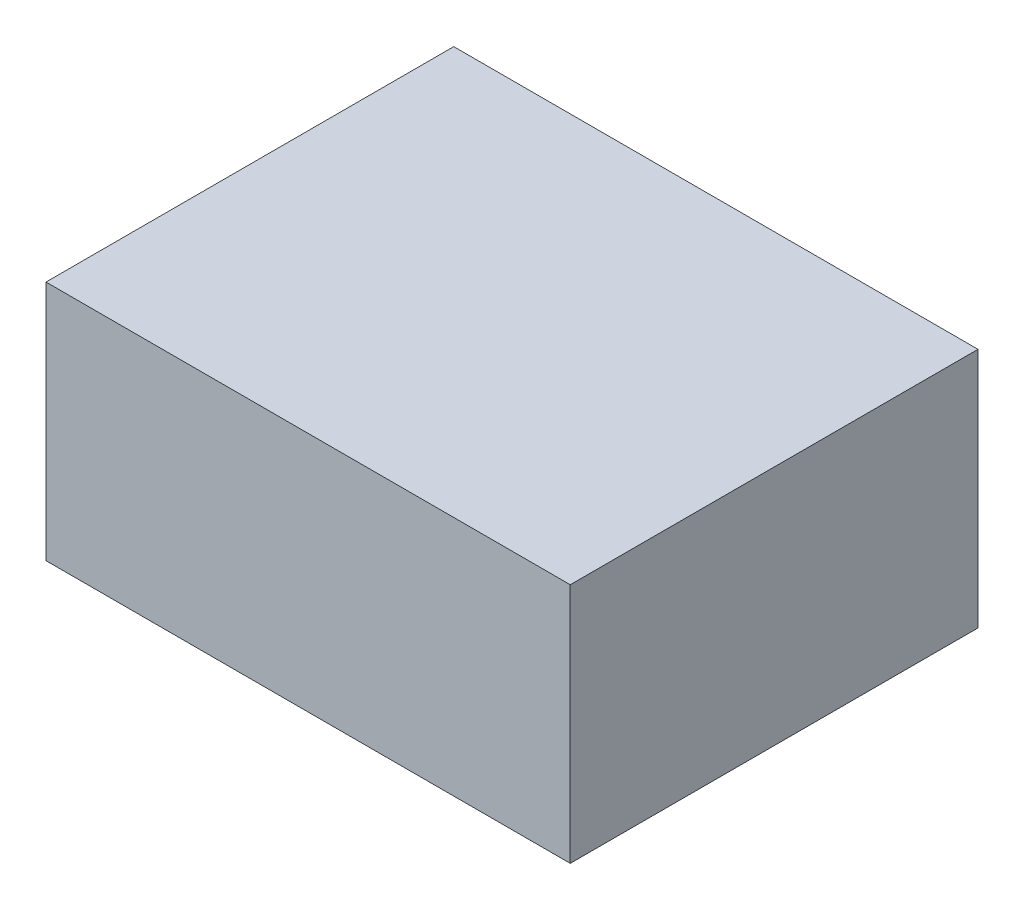
ISO-10303-21;
HEADER;
FILE_DESCRIPTION(('STEP AP214'),'2;1');
FILE_NAME('part.step','',(''),(''),'','','');
FILE_SCHEMA(('AUTOMOTIVE_DESIGN { 1 0 10303 214 1 1 1 1 }'));
ENDSEC;
DATA;
#1=APPLICATION_CONTEXT('core data for automotive mechanical design processes');
#2=APPLICATION_PROTOCOL_DEFINITION('international standard','automotive_design',2000,#1);
#3=PRODUCT_CONTEXT('',#1,'mechanical');
#4=PRODUCT('Part','Part','',(#3));
#5=PRODUCT_RELATED_PRODUCT_CATEGORY('part','',(#4));
#6=PRODUCT_DEFINITION_FORMATION('','',#4);
#7=PRODUCT_DEFINITION_CONTEXT('part definition',#1,'design');
#8=PRODUCT_DEFINITION('design','',#6,#7);
#9=PRODUCT_DEFINITION_SHAPE('','',#8);
#10=(LENGTH_UNIT() NAMED_UNIT(*) SI_UNIT(.MILLI.,.METRE.));
#11=(NAMED_UNIT(*) PLANE_ANGLE_UNIT() SI_UNIT($,.RADIAN.));
#12=(NAMED_UNIT(*) SI_UNIT($,.STERADIAN.) SOLID_ANGLE_UNIT());
#13=UNCERTAINTY_MEASURE_WITH_UNIT(LENGTH_MEASURE(1.E-05),#10,'distance_accuracy_value','');
#14=(GEOMETRIC_REPRESENTATION_CONTEXT(3) GLOBAL_UNCERTAINTY_ASSIGNED_CONTEXT((#13)) GLOBAL_UNIT_ASSIGNED_CONTEXT((#10,
#11,#12)) REPRESENTATION_CONTEXT('',''));
#15=CARTESIAN_POINT('',(0.,0.,0.));
#16=DIRECTION('',(0.,0.,1.));
#17=DIRECTION('',(1.,0.,0.));
#18=AXIS2_PLACEMENT_3D('',#15,#16,#17);
#19=CARTESIAN_POINT('',(3.15000132,1.44999964,0.));
#20=DIRECTION('',(0.,-1.,0.));
#21=DIRECTION('',(0.,0.,-1.));
#22=AXIS2_PLACEMENT_3D('',#19,#20,#21);
#23=PLANE('',#22);
#24=DIRECTION('',(0.,0.,-1.));
#25=VECTOR('',#24,1.);
#26=CARTESIAN_POINT('',(-3.14999878,1.44999964,0.));
#27=LINE('',#26,#25);
#28=CARTESIAN_POINT('',(-3.14999878,1.44999964,0.));
#29=VERTEX_POINT('',#28);
#30=CARTESIAN_POINT('',(-3.14999878,1.44999964,4.90000036));
#31=VERTEX_POINT('',#30);
#32=EDGE_CURVE('E20',#29,#31,#27,.F.);
#33=ORIENTED_EDGE('',*,*,#32,.T.);
#34=DIRECTION('',(-1.,0.,0.));
#35=VECTOR('',#34,1.);
#36=CARTESIAN_POINT('',(-3.14999878,1.44999964,4.90000036));
#37=LINE('',#36,#35);
#38=CARTESIAN_POINT('',(3.15000132,1.44999964,4.90000036));
#39=VERTEX_POINT('',#38);
#40=EDGE_CURVE('E55',#31,#39,#37,.F.);
#41=ORIENTED_EDGE('',*,*,#40,.T.);
#42=DIRECTION('',(0.,0.,1.));
#43=VECTOR('',#42,1.);
#44=CARTESIAN_POINT('',(3.15000132,1.44999964,0.));
#45=LINE('',#44,#43);
#46=CARTESIAN_POINT('',(3.15000132,1.44999964,0.));
#47=VERTEX_POINT('',#46);
#48=EDGE_CURVE('E76',#39,#47,#45,.F.);
#49=ORIENTED_EDGE('',*,*,#48,.T.);
#50=DIRECTION('',(-1.,0.,0.));
#51=VECTOR('',#50,1.);
#52=CARTESIAN_POINT('',(-3.14999878,1.44999964,0.));
#53=LINE('',#52,#51);
#54=EDGE_CURVE('E58',#29,#47,#53,.F.);
#55=ORIENTED_EDGE('',*,*,#54,.F.);
#56=EDGE_LOOP('',(#33,#41,#49,#55));
#57=FACE_BOUND('',#56,.T.);
#58=ADVANCED_FACE('F17',(#57),#23,.F.);
#59=CARTESIAN_POINT('',(-3.14999878,1.44999964,0.));
#60=DIRECTION('',(1.,0.,0.));
#61=DIRECTION('',(0.,0.,-1.));
#62=AXIS2_PLACEMENT_3D('',#59,#60,#61);
#63=PLANE('',#62);
#64=DIRECTION('',(0.,0.,1.));
#65=VECTOR('',#64,1.);
#66=CARTESIAN_POINT('',(-3.14999878,-1.44999964,0.));
#67=LINE('',#66,#65);
#68=CARTESIAN_POINT('',(-3.14999878,-1.44999964,0.));
#69=VERTEX_POINT('',#68);
#70=CARTESIAN_POINT('',(-3.14999878,-1.44999964,4.90000036));
#71=VERTEX_POINT('',#70);
#72=EDGE_CURVE('E73',#69,#71,#67,.T.);
#73=ORIENTED_EDGE('',*,*,#72,.T.);
#74=DIRECTION('',(0.,1.,0.));
#75=VECTOR('',#74,1.);
#76=CARTESIAN_POINT('',(-3.14999878,-1.44999964,4.90000036));
#77=LINE('',#76,#75);
#78=EDGE_CURVE('E63',#71,#31,#77,.T.);
#79=ORIENTED_EDGE('',*,*,#78,.T.);
#80=ORIENTED_EDGE('',*,*,#32,.F.);
#81=DIRECTION('',(0.,1.,0.));
#82=VECTOR('',#81,1.);
#83=CARTESIAN_POINT('',(-3.14999878,-1.44999964,0.));
#84=LINE('',#83,#82);
#85=EDGE_CURVE('E78',#69,#29,#84,.T.);
#86=ORIENTED_EDGE('',*,*,#85,.F.);
#87=EDGE_LOOP('',(#73,#79,#80,#86));
#88=FACE_BOUND('',#87,.T.);
#89=ADVANCED_FACE('F72',(#88),#63,.F.);
#90=CARTESIAN_POINT('',(-3.14999878,-1.44999964,4.90000036));
#91=DIRECTION('',(0.,0.,-1.));
#92=DIRECTION('',(-1.,0.,0.));
#93=AXIS2_PLACEMENT_3D('',#90,#91,#92);
#94=PLANE('',#93);
#95=DIRECTION('',(0.,1.,0.));
#96=VECTOR('',#95,1.);
#97=CARTESIAN_POINT('',(3.15000132,-1.44999964,4.90000036));
#98=LINE('',#97,#96);
#99=CARTESIAN_POINT('',(3.15000132,-1.44999964,4.90000036));
#100=VERTEX_POINT('',#99);
#101=EDGE_CURVE('E69',#100,#39,#98,.T.);
#102=ORIENTED_EDGE('',*,*,#101,.T.);
#103=ORIENTED_EDGE('',*,*,#40,.F.);
#104=ORIENTED_EDGE('',*,*,#78,.F.);
#105=DIRECTION('',(1.,0.,0.));
#106=VECTOR('',#105,1.);
#107=CARTESIAN_POINT('',(-3.14999878,-1.44999964,4.90000036));
#108=LINE('',#107,#106);
#109=EDGE_CURVE('E83',#71,#100,#108,.T.);
#110=ORIENTED_EDGE('',*,*,#109,.T.);
#111=EDGE_LOOP('',(#102,#103,#104,#110));
#112=FACE_BOUND('',#111,.T.);
#113=ADVANCED_FACE('F66',(#112),#94,.F.);
#114=CARTESIAN_POINT('',(3.15000132,-1.44999964,0.));
#115=DIRECTION('',(-1.,0.,0.));
#116=DIRECTION('',(0.,0.,1.));
#117=AXIS2_PLACEMENT_3D('',#114,#115,#116);
#118=PLANE('',#117);
#119=ORIENTED_EDGE('',*,*,#48,.F.);
#120=ORIENTED_EDGE('',*,*,#101,.F.);
#121=DIRECTION('',(0.,0.,1.));
#122=VECTOR('',#121,1.);
#123=CARTESIAN_POINT('',(3.15000132,-1.44999964,0.));
#124=LINE('',#123,#122);
#125=CARTESIAN_POINT('',(3.15000132,-1.44999964,0.));
#126=VERTEX_POINT('',#125);
#127=EDGE_CURVE('E26',#100,#126,#124,.F.);
#128=ORIENTED_EDGE('',*,*,#127,.T.);
#129=DIRECTION('',(0.,1.,0.));
#130=VECTOR('',#129,1.);
#131=CARTESIAN_POINT('',(3.15000132,-1.44999964,0.));
#132=LINE('',#131,#130);
#133=EDGE_CURVE('E34',#47,#126,#132,.F.);
#134=ORIENTED_EDGE('',*,*,#133,.F.);
#135=EDGE_LOOP('',(#119,#120,#128,#134));
#136=FACE_BOUND('',#135,.T.);
#137=ADVANCED_FACE('F88',(#136),#118,.F.);
#138=CARTESIAN_POINT('',(-3.14999878,-1.44999964,0.));
#139=DIRECTION('',(0.,0.,-1.));
#140=DIRECTION('',(-1.,0.,0.));
#141=AXIS2_PLACEMENT_3D('',#138,#139,#140);
#142=PLANE('',#141);
#143=ORIENTED_EDGE('',*,*,#133,.T.);
#144=DIRECTION('',(1.,0.,0.));
#145=VECTOR('',#144,1.);
#146=CARTESIAN_POINT('',(-3.14999878,-1.44999964,0.));
#147=LINE('',#146,#145);
#148=EDGE_CURVE('E11',#126,#69,#147,.F.);
#149=ORIENTED_EDGE('',*,*,#148,.T.);
#150=ORIENTED_EDGE('',*,*,#85,.T.);
#151=ORIENTED_EDGE('',*,*,#54,.T.);
#152=EDGE_LOOP('',(#143,#149,#150,#151));
#153=FACE_BOUND('',#152,.T.);
#154=ADVANCED_FACE('F91',(#153),#142,.T.);
#155=CARTESIAN_POINT('',(-3.14999878,-1.44999964,0.));
#156=DIRECTION('',(0.,1.,0.));
#157=DIRECTION('',(0.,0.,1.));
#158=AXIS2_PLACEMENT_3D('',#155,#156,#157);
#159=PLANE('',#158);
#160=ORIENTED_EDGE('',*,*,#127,.F.);
#161=ORIENTED_EDGE('',*,*,#109,.F.);
#162=ORIENTED_EDGE('',*,*,#72,.F.);
#163=ORIENTED_EDGE('',*,*,#148,.F.);
#164=EDGE_LOOP('',(#160,#161,#162,#163));
#165=FACE_BOUND('',#164,.T.);
#166=ADVANCED_FACE('F90',(#165),#159,.F.);
#167=CLOSED_SHELL('',(#58,#89,#113,#137,#154,#166));
#168=MANIFOLD_SOLID_BREP('B1',#167);
#169=ADVANCED_BREP_SHAPE_REPRESENTATION('',(#18,#168),#14);
#170=SHAPE_DEFINITION_REPRESENTATION(#9,#169);
ENDSEC;
END-ISO-10303-21;
